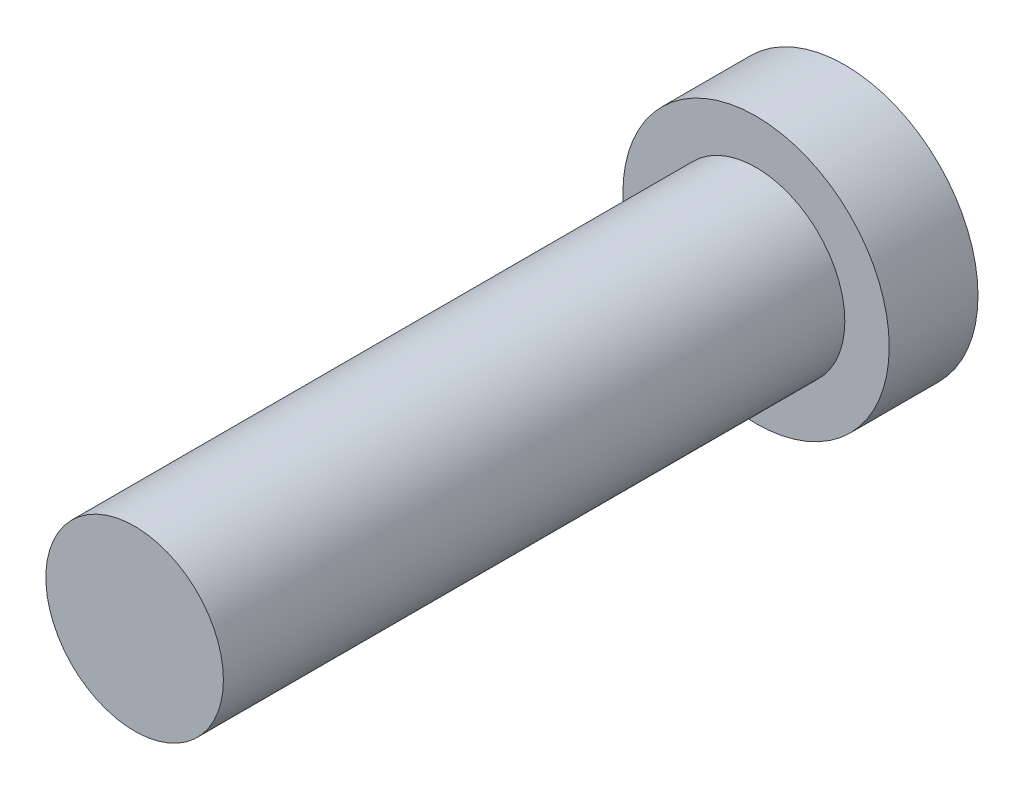
ISO-10303-21;
HEADER;
FILE_DESCRIPTION(('STEP AP214'),'2;1');
FILE_NAME('part.step','',(''),(''),'','','');
FILE_SCHEMA(('AUTOMOTIVE_DESIGN { 1 0 10303 214 1 1 1 1 }'));
ENDSEC;
DATA;
#1=APPLICATION_CONTEXT('core data for automotive mechanical design processes');
#2=APPLICATION_PROTOCOL_DEFINITION('international standard','automotive_design',2000,#1);
#3=PRODUCT_CONTEXT('',#1,'mechanical');
#4=PRODUCT('Part','Part','',(#3));
#5=PRODUCT_RELATED_PRODUCT_CATEGORY('part','',(#4));
#6=PRODUCT_DEFINITION_FORMATION('','',#4);
#7=PRODUCT_DEFINITION_CONTEXT('part definition',#1,'design');
#8=PRODUCT_DEFINITION('design','',#6,#7);
#9=PRODUCT_DEFINITION_SHAPE('','',#8);
#10=(LENGTH_UNIT() NAMED_UNIT(*) SI_UNIT(.MILLI.,.METRE.));
#11=(NAMED_UNIT(*) PLANE_ANGLE_UNIT() SI_UNIT($,.RADIAN.));
#12=(NAMED_UNIT(*) SI_UNIT($,.STERADIAN.) SOLID_ANGLE_UNIT());
#13=UNCERTAINTY_MEASURE_WITH_UNIT(LENGTH_MEASURE(1.E-05),#10,'distance_accuracy_value','');
#14=(GEOMETRIC_REPRESENTATION_CONTEXT(3) GLOBAL_UNCERTAINTY_ASSIGNED_CONTEXT((#13)) GLOBAL_UNIT_ASSIGNED_CONTEXT((#10,
#11,#12)) REPRESENTATION_CONTEXT('',''));
#15=CARTESIAN_POINT('',(0.,0.,0.));
#16=DIRECTION('',(0.,0.,1.));
#17=DIRECTION('',(1.,0.,0.));
#18=AXIS2_PLACEMENT_3D('',#15,#16,#17);
#19=CARTESIAN_POINT('',(0.,0.,35.));
#20=DIRECTION('',(0.,0.,-1.));
#21=DIRECTION('',(-1.,0.,0.));
#22=AXIS2_PLACEMENT_3D('',#19,#20,#21);
#23=CYLINDRICAL_SURFACE('',#22,5.);
#24=CARTESIAN_POINT('',(0.,0.,35.));
#25=DIRECTION('',(0.,0.,1.));
#26=DIRECTION('',(1.,0.,0.));
#27=AXIS2_PLACEMENT_3D('',#24,#25,#26);
#28=CIRCLE('',#27,5.);
#29=CARTESIAN_POINT('',(5.,0.,35.));
#30=VERTEX_POINT('',#29);
#31=EDGE_CURVE('E10',#30,#30,#28,.T.);
#32=ORIENTED_EDGE('',*,*,#31,.F.);
#33=EDGE_LOOP('',(#32));
#34=FACE_BOUND('',#33,.T.);
#35=CARTESIAN_POINT('',(0.,0.,0.));
#36=DIRECTION('',(0.,0.,1.));
#37=DIRECTION('',(1.,0.,0.));
#38=AXIS2_PLACEMENT_3D('',#35,#36,#37);
#39=CIRCLE('',#38,5.);
#40=CARTESIAN_POINT('',(5.,0.,0.));
#41=VERTEX_POINT('',#40);
#42=EDGE_CURVE('E35',#41,#41,#39,.T.);
#43=ORIENTED_EDGE('',*,*,#42,.T.);
#44=EDGE_LOOP('',(#43));
#45=FACE_BOUND('',#44,.T.);
#46=ADVANCED_FACE('F32',(#34,#45),#23,.T.);
#47=CARTESIAN_POINT('',(0.,0.,35.));
#48=DIRECTION('',(0.,0.,1.));
#49=DIRECTION('',(1.,0.,0.));
#50=AXIS2_PLACEMENT_3D('',#47,#48,#49);
#51=PLANE('',#50);
#52=ORIENTED_EDGE('',*,*,#31,.T.);
#53=EDGE_LOOP('',(#52));
#54=FACE_BOUND('',#53,.T.);
#55=ADVANCED_FACE('F55',(#54),#51,.T.);
#56=CARTESIAN_POINT('',(0.,0.,-5.));
#57=DIRECTION('',(0.,0.,1.));
#58=DIRECTION('',(1.,0.,0.));
#59=AXIS2_PLACEMENT_3D('',#56,#57,#58);
#60=CYLINDRICAL_SURFACE('',#59,7.5);
#61=CARTESIAN_POINT('',(0.,0.,-5.));
#62=DIRECTION('',(0.,0.,-1.));
#63=DIRECTION('',(-1.,0.,0.));
#64=AXIS2_PLACEMENT_3D('',#61,#62,#63);
#65=CIRCLE('',#64,7.5);
#66=CARTESIAN_POINT('',(-7.5,0.,-5.));
#67=VERTEX_POINT('',#66);
#68=EDGE_CURVE('E42',#67,#67,#65,.T.);
#69=ORIENTED_EDGE('',*,*,#68,.F.);
#70=EDGE_LOOP('',(#69));
#71=FACE_BOUND('',#70,.T.);
#72=CARTESIAN_POINT('',(0.,0.,0.));
#73=DIRECTION('',(0.,0.,-1.));
#74=DIRECTION('',(-1.,0.,0.));
#75=AXIS2_PLACEMENT_3D('',#72,#73,#74);
#76=CIRCLE('',#75,7.5);
#77=CARTESIAN_POINT('',(-7.5,0.,0.));
#78=VERTEX_POINT('',#77);
#79=EDGE_CURVE('E44',#78,#78,#76,.T.);
#80=ORIENTED_EDGE('',*,*,#79,.T.);
#81=EDGE_LOOP('',(#80));
#82=FACE_BOUND('',#81,.T.);
#83=ADVANCED_FACE('F52',(#71,#82),#60,.T.);
#84=CARTESIAN_POINT('',(0.,0.,-5.));
#85=DIRECTION('',(0.,0.,-1.));
#86=DIRECTION('',(-1.,0.,0.));
#87=AXIS2_PLACEMENT_3D('',#84,#85,#86);
#88=PLANE('',#87);
#89=ORIENTED_EDGE('',*,*,#68,.T.);
#90=EDGE_LOOP('',(#89));
#91=FACE_BOUND('',#90,.T.);
#92=ADVANCED_FACE('F50',(#91),#88,.T.);
#93=CARTESIAN_POINT('',(0.,0.,0.));
#94=DIRECTION('',(0.,0.,-1.));
#95=DIRECTION('',(-1.,0.,0.));
#96=AXIS2_PLACEMENT_3D('',#93,#94,#95);
#97=PLANE('',#96);
#98=ORIENTED_EDGE('',*,*,#42,.F.);
#99=EDGE_LOOP('',(#98));
#100=FACE_BOUND('',#99,.T.);
#101=ORIENTED_EDGE('',*,*,#79,.F.);
#102=EDGE_LOOP('',(#101));
#103=FACE_BOUND('',#102,.T.);
#104=ADVANCED_FACE('F59',(#100,#103),#97,.F.);
#105=CLOSED_SHELL('',(#46,#55,#83,#92,#104));
#106=MANIFOLD_SOLID_BREP('B2',#105);
#107=ADVANCED_BREP_SHAPE_REPRESENTATION('',(#18,#106),#14);
#108=SHAPE_DEFINITION_REPRESENTATION(#9,#107);
ENDSEC;
END-ISO-10303-21;
